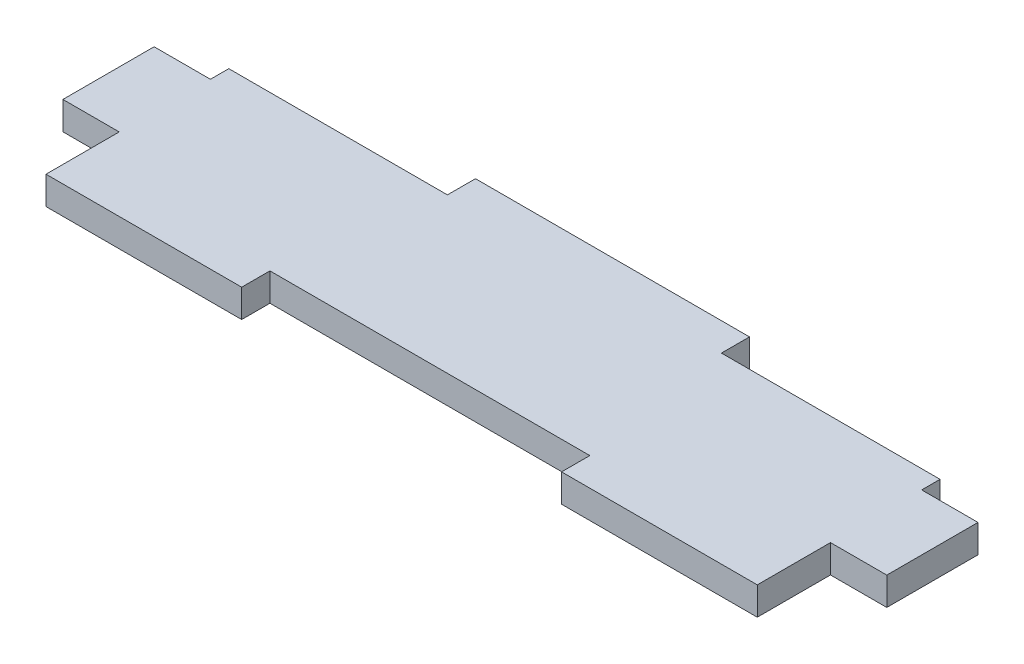
ISO-10303-21;
HEADER;
FILE_DESCRIPTION(('STEP AP214'),'2;1');
FILE_NAME('part.step','',(''),(''),'','','');
FILE_SCHEMA(('AUTOMOTIVE_DESIGN { 1 0 10303 214 1 1 1 1 }'));
ENDSEC;
DATA;
#1=APPLICATION_CONTEXT('core data for automotive mechanical design processes');
#2=APPLICATION_PROTOCOL_DEFINITION('international standard','automotive_design',2000,#1);
#3=PRODUCT_CONTEXT('',#1,'mechanical');
#4=PRODUCT('Part','Part','',(#3));
#5=PRODUCT_RELATED_PRODUCT_CATEGORY('part','',(#4));
#6=PRODUCT_DEFINITION_FORMATION('','',#4);
#7=PRODUCT_DEFINITION_CONTEXT('part definition',#1,'design');
#8=PRODUCT_DEFINITION('design','',#6,#7);
#9=PRODUCT_DEFINITION_SHAPE('','',#8);
#10=(LENGTH_UNIT() NAMED_UNIT(*) SI_UNIT(.MILLI.,.METRE.));
#11=(NAMED_UNIT(*) PLANE_ANGLE_UNIT() SI_UNIT($,.RADIAN.));
#12=(NAMED_UNIT(*) SI_UNIT($,.STERADIAN.) SOLID_ANGLE_UNIT());
#13=UNCERTAINTY_MEASURE_WITH_UNIT(LENGTH_MEASURE(1.E-05),#10,'distance_accuracy_value','');
#14=(GEOMETRIC_REPRESENTATION_CONTEXT(3) GLOBAL_UNCERTAINTY_ASSIGNED_CONTEXT((#13)) GLOBAL_UNIT_ASSIGNED_CONTEXT((#10,
#11,#12)) REPRESENTATION_CONTEXT('',''));
#15=CARTESIAN_POINT('',(0.,0.,0.));
#16=DIRECTION('',(0.,0.,1.));
#17=DIRECTION('',(1.,0.,0.));
#18=AXIS2_PLACEMENT_3D('',#15,#16,#17);
#19=CARTESIAN_POINT('',(14.99,-289.95,-3.08));
#20=DIRECTION('',(0.,0.,1.));
#21=DIRECTION('',(1.,0.,0.));
#22=AXIS2_PLACEMENT_3D('',#19,#20,#21);
#23=PLANE('',#22);
#24=DIRECTION('',(1.,0.,0.));
#25=VECTOR('',#24,1.);
#26=CARTESIAN_POINT('',(14.99,-286.88,-3.08));
#27=LINE('',#26,#25);
#28=CARTESIAN_POINT('',(-14.99,-286.88,-3.08));
#29=VERTEX_POINT('',#28);
#30=CARTESIAN_POINT('',(14.99,-286.88,-3.08));
#31=VERTEX_POINT('',#30);
#32=EDGE_CURVE('E211',#29,#31,#27,.T.);
#33=ORIENTED_EDGE('',*,*,#32,.T.);
#34=DIRECTION('',(0.,1.,0.));
#35=VECTOR('',#34,1.);
#36=CARTESIAN_POINT('',(14.99,-289.95,-3.08));
#37=LINE('',#36,#35);
#38=CARTESIAN_POINT('',(14.99,-289.95,-3.08));
#39=VERTEX_POINT('',#38);
#40=EDGE_CURVE('E11',#39,#31,#37,.T.);
#41=ORIENTED_EDGE('',*,*,#40,.F.);
#42=DIRECTION('',(1.,0.,0.));
#43=VECTOR('',#42,1.);
#44=CARTESIAN_POINT('',(14.99,-289.95,-3.08));
#45=LINE('',#44,#43);
#46=CARTESIAN_POINT('',(-14.99,-289.95,-3.08));
#47=VERTEX_POINT('',#46);
#48=EDGE_CURVE('E249',#47,#39,#45,.T.);
#49=ORIENTED_EDGE('',*,*,#48,.F.);
#50=DIRECTION('',(0.,1.,0.));
#51=VECTOR('',#50,1.);
#52=CARTESIAN_POINT('',(-14.99,-289.95,-3.08));
#53=LINE('',#52,#51);
#54=EDGE_CURVE('E207',#47,#29,#53,.T.);
#55=ORIENTED_EDGE('',*,*,#54,.T.);
#56=EDGE_LOOP('',(#33,#41,#49,#55));
#57=FACE_BOUND('',#56,.T.);
#58=ADVANCED_FACE('F43',(#57),#23,.F.);
#59=CARTESIAN_POINT('',(14.99,-289.95,-3.08));
#60=DIRECTION('',(-1.,0.,0.));
#61=DIRECTION('',(0.,0.,1.));
#62=AXIS2_PLACEMENT_3D('',#59,#60,#61);
#63=PLANE('',#62);
#64=DIRECTION('',(0.,0.,1.));
#65=VECTOR('',#64,1.);
#66=CARTESIAN_POINT('',(14.99,-286.88,-3.08));
#67=LINE('',#66,#65);
#68=CARTESIAN_POINT('',(14.99,-286.88,-0.0100000000000031));
#69=VERTEX_POINT('',#68);
#70=EDGE_CURVE('E214',#31,#69,#67,.T.);
#71=ORIENTED_EDGE('',*,*,#70,.T.);
#72=DIRECTION('',(0.,1.,0.));
#73=VECTOR('',#72,1.);
#74=CARTESIAN_POINT('',(14.99,-289.95,-0.0100000000000031));
#75=LINE('',#74,#73);
#76=CARTESIAN_POINT('',(14.99,-289.95,-0.0100000000000031));
#77=VERTEX_POINT('',#76);
#78=EDGE_CURVE('E51',#77,#69,#75,.T.);
#79=ORIENTED_EDGE('',*,*,#78,.F.);
#80=DIRECTION('',(0.,0.,1.));
#81=VECTOR('',#80,1.);
#82=CARTESIAN_POINT('',(14.99,-289.95,-3.08));
#83=LINE('',#82,#81);
#84=EDGE_CURVE('E138',#39,#77,#83,.T.);
#85=ORIENTED_EDGE('',*,*,#84,.F.);
#86=ORIENTED_EDGE('',*,*,#40,.T.);
#87=EDGE_LOOP('',(#71,#79,#85,#86));
#88=FACE_BOUND('',#87,.T.);
#89=ADVANCED_FACE('F368',(#88),#63,.F.);
#90=CARTESIAN_POINT('',(14.99,-289.95,-0.0100000000000031));
#91=DIRECTION('',(0.,0.,1.));
#92=DIRECTION('',(1.,0.,0.));
#93=AXIS2_PLACEMENT_3D('',#90,#91,#92);
#94=PLANE('',#93);
#95=DIRECTION('',(1.,0.,0.));
#96=VECTOR('',#95,1.);
#97=CARTESIAN_POINT('',(14.99,-286.88,-0.0100000000000031));
#98=LINE('',#97,#96);
#99=CARTESIAN_POINT('',(38.9099999999999,-286.88,-0.0100000000000069));
#100=VERTEX_POINT('',#99);
#101=EDGE_CURVE('E216',#69,#100,#98,.T.);
#102=ORIENTED_EDGE('',*,*,#101,.T.);
#103=DIRECTION('',(0.,1.,0.));
#104=VECTOR('',#103,1.);
#105=CARTESIAN_POINT('',(38.9099999999999,-289.95,-0.0100000000000069));
#106=LINE('',#105,#104);
#107=CARTESIAN_POINT('',(38.9099999999999,-289.95,-0.0100000000000069));
#108=VERTEX_POINT('',#107);
#109=EDGE_CURVE('E292',#108,#100,#106,.T.);
#110=ORIENTED_EDGE('',*,*,#109,.F.);
#111=DIRECTION('',(1.,0.,0.));
#112=VECTOR('',#111,1.);
#113=CARTESIAN_POINT('',(14.99,-289.95,-0.0100000000000031));
#114=LINE('',#113,#112);
#115=EDGE_CURVE('E300',#77,#108,#114,.T.);
#116=ORIENTED_EDGE('',*,*,#115,.F.);
#117=ORIENTED_EDGE('',*,*,#78,.T.);
#118=EDGE_LOOP('',(#102,#110,#116,#117));
#119=FACE_BOUND('',#118,.T.);
#120=ADVANCED_FACE('F298',(#119),#94,.F.);
#121=CARTESIAN_POINT('',(38.9099999999999,-289.95,-0.0100000000000069));
#122=DIRECTION('',(-1.,0.,0.));
#123=DIRECTION('',(0.,0.,1.));
#124=AXIS2_PLACEMENT_3D('',#121,#122,#123);
#125=PLANE('',#124);
#126=DIRECTION('',(0.,0.,1.));
#127=VECTOR('',#126,1.);
#128=CARTESIAN_POINT('',(38.9099999999999,-286.88,-0.0100000000000069));
#129=LINE('',#128,#127);
#130=CARTESIAN_POINT('',(38.9099999999999,-286.88,2.00000000000001));
#131=VERTEX_POINT('',#130);
#132=EDGE_CURVE('E218',#100,#131,#129,.T.);
#133=ORIENTED_EDGE('',*,*,#132,.T.);
#134=DIRECTION('',(0.,1.,0.));
#135=VECTOR('',#134,1.);
#136=CARTESIAN_POINT('',(38.9099999999999,-289.95,2.00000000000001));
#137=LINE('',#136,#135);
#138=CARTESIAN_POINT('',(38.9099999999999,-289.95,2.00000000000001));
#139=VERTEX_POINT('',#138);
#140=EDGE_CURVE('E289',#139,#131,#137,.T.);
#141=ORIENTED_EDGE('',*,*,#140,.F.);
#142=DIRECTION('',(0.,0.,1.));
#143=VECTOR('',#142,1.);
#144=CARTESIAN_POINT('',(38.9099999999999,-289.95,-0.0100000000000069));
#145=LINE('',#144,#143);
#146=EDGE_CURVE('E318',#108,#139,#145,.T.);
#147=ORIENTED_EDGE('',*,*,#146,.F.);
#148=ORIENTED_EDGE('',*,*,#109,.T.);
#149=EDGE_LOOP('',(#133,#141,#147,#148));
#150=FACE_BOUND('',#149,.T.);
#151=ADVANCED_FACE('F309',(#150),#125,.F.);
#152=CARTESIAN_POINT('',(38.9099999999999,-289.95,2.00000000000001));
#153=DIRECTION('',(0.,0.,1.));
#154=DIRECTION('',(1.,0.,0.));
#155=AXIS2_PLACEMENT_3D('',#152,#153,#154);
#156=PLANE('',#155);
#157=DIRECTION('',(1.,0.,0.));
#158=VECTOR('',#157,1.);
#159=CARTESIAN_POINT('',(38.9099999999999,-286.88,2.00000000000001));
#160=LINE('',#159,#158);
#161=CARTESIAN_POINT('',(45.07,-286.88,2.));
#162=VERTEX_POINT('',#161);
#163=EDGE_CURVE('E220',#131,#162,#160,.T.);
#164=ORIENTED_EDGE('',*,*,#163,.T.);
#165=DIRECTION('',(0.,1.,0.));
#166=VECTOR('',#165,1.);
#167=CARTESIAN_POINT('',(45.07,-289.95,2.));
#168=LINE('',#167,#166);
#169=CARTESIAN_POINT('',(45.07,-289.95,2.));
#170=VERTEX_POINT('',#169);
#171=EDGE_CURVE('E286',#170,#162,#168,.T.);
#172=ORIENTED_EDGE('',*,*,#171,.F.);
#173=DIRECTION('',(1.,0.,0.));
#174=VECTOR('',#173,1.);
#175=CARTESIAN_POINT('',(38.9099999999999,-289.95,2.00000000000001));
#176=LINE('',#175,#174);
#177=EDGE_CURVE('E315',#139,#170,#176,.T.);
#178=ORIENTED_EDGE('',*,*,#177,.F.);
#179=ORIENTED_EDGE('',*,*,#140,.T.);
#180=EDGE_LOOP('',(#164,#172,#178,#179));
#181=FACE_BOUND('',#180,.T.);
#182=ADVANCED_FACE('F313',(#181),#156,.F.);
#183=CARTESIAN_POINT('',(45.07,-289.95,2.));
#184=DIRECTION('',(-1.,0.,0.));
#185=DIRECTION('',(0.,0.,1.));
#186=AXIS2_PLACEMENT_3D('',#183,#184,#185);
#187=PLANE('',#186);
#188=DIRECTION('',(0.,0.,1.));
#189=VECTOR('',#188,1.);
#190=CARTESIAN_POINT('',(45.07,-286.88,2.));
#191=LINE('',#190,#189);
#192=CARTESIAN_POINT('',(45.07,-286.88,11.98));
#193=VERTEX_POINT('',#192);
#194=EDGE_CURVE('E222',#162,#193,#191,.T.);
#195=ORIENTED_EDGE('',*,*,#194,.T.);
#196=DIRECTION('',(0.,1.,0.));
#197=VECTOR('',#196,1.);
#198=CARTESIAN_POINT('',(45.07,-289.95,11.98));
#199=LINE('',#198,#197);
#200=CARTESIAN_POINT('',(45.07,-289.95,11.98));
#201=VERTEX_POINT('',#200);
#202=EDGE_CURVE('E283',#201,#193,#199,.T.);
#203=ORIENTED_EDGE('',*,*,#202,.F.);
#204=DIRECTION('',(0.,0.,1.));
#205=VECTOR('',#204,1.);
#206=CARTESIAN_POINT('',(45.07,-289.95,2.));
#207=LINE('',#206,#205);
#208=EDGE_CURVE('E317',#170,#201,#207,.T.);
#209=ORIENTED_EDGE('',*,*,#208,.F.);
#210=ORIENTED_EDGE('',*,*,#171,.T.);
#211=EDGE_LOOP('',(#195,#203,#209,#210));
#212=FACE_BOUND('',#211,.T.);
#213=ADVANCED_FACE('F383',(#212),#187,.F.);
#214=CARTESIAN_POINT('',(45.07,-289.95,11.98));
#215=DIRECTION('',(0.,0.,-1.));
#216=DIRECTION('',(-1.,0.,0.));
#217=AXIS2_PLACEMENT_3D('',#214,#215,#216);
#218=PLANE('',#217);
#219=DIRECTION('',(-1.,0.,0.));
#220=VECTOR('',#219,1.);
#221=CARTESIAN_POINT('',(45.07,-286.88,11.98));
#222=LINE('',#221,#220);
#223=CARTESIAN_POINT('',(38.9099999999999,-286.88,11.98));
#224=VERTEX_POINT('',#223);
#225=EDGE_CURVE('E224',#193,#224,#222,.T.);
#226=ORIENTED_EDGE('',*,*,#225,.T.);
#227=DIRECTION('',(0.,1.,0.));
#228=VECTOR('',#227,1.);
#229=CARTESIAN_POINT('',(38.9099999999999,-289.95,11.98));
#230=LINE('',#229,#228);
#231=CARTESIAN_POINT('',(38.9099999999999,-289.95,11.98));
#232=VERTEX_POINT('',#231);
#233=EDGE_CURVE('E280',#232,#224,#230,.T.);
#234=ORIENTED_EDGE('',*,*,#233,.F.);
#235=DIRECTION('',(-1.,0.,0.));
#236=VECTOR('',#235,1.);
#237=CARTESIAN_POINT('',(45.07,-289.95,11.98));
#238=LINE('',#237,#236);
#239=EDGE_CURVE('E320',#201,#232,#238,.T.);
#240=ORIENTED_EDGE('',*,*,#239,.F.);
#241=ORIENTED_EDGE('',*,*,#202,.T.);
#242=EDGE_LOOP('',(#226,#234,#240,#241));
#243=FACE_BOUND('',#242,.T.);
#244=ADVANCED_FACE('F386',(#243),#218,.F.);
#245=CARTESIAN_POINT('',(38.9099999999999,-289.95,11.98));
#246=DIRECTION('',(-1.,0.,0.));
#247=DIRECTION('',(0.,0.,1.));
#248=AXIS2_PLACEMENT_3D('',#245,#246,#247);
#249=PLANE('',#248);
#250=DIRECTION('',(0.,0.,1.));
#251=VECTOR('',#250,1.);
#252=CARTESIAN_POINT('',(38.9099999999999,-286.88,11.98));
#253=LINE('',#252,#251);
#254=CARTESIAN_POINT('',(38.9099999999999,-286.88,19.99));
#255=VERTEX_POINT('',#254);
#256=EDGE_CURVE('E226',#224,#255,#253,.T.);
#257=ORIENTED_EDGE('',*,*,#256,.T.);
#258=DIRECTION('',(0.,1.,0.));
#259=VECTOR('',#258,1.);
#260=CARTESIAN_POINT('',(38.9099999999999,-289.95,19.99));
#261=LINE('',#260,#259);
#262=CARTESIAN_POINT('',(38.9099999999999,-289.95,19.99));
#263=VERTEX_POINT('',#262);
#264=EDGE_CURVE('E277',#263,#255,#261,.T.);
#265=ORIENTED_EDGE('',*,*,#264,.F.);
#266=DIRECTION('',(0.,0.,1.));
#267=VECTOR('',#266,1.);
#268=CARTESIAN_POINT('',(38.9099999999999,-289.95,11.98));
#269=LINE('',#268,#267);
#270=EDGE_CURVE('E326',#232,#263,#269,.T.);
#271=ORIENTED_EDGE('',*,*,#270,.F.);
#272=ORIENTED_EDGE('',*,*,#233,.T.);
#273=EDGE_LOOP('',(#257,#265,#271,#272));
#274=FACE_BOUND('',#273,.T.);
#275=ADVANCED_FACE('F390',(#274),#249,.F.);
#276=CARTESIAN_POINT('',(17.5,-289.95,19.99));
#277=DIRECTION('',(0.,0.,-1.));
#278=DIRECTION('',(-1.,0.,0.));
#279=AXIS2_PLACEMENT_3D('',#276,#277,#278);
#280=PLANE('',#279);
#281=DIRECTION('',(-1.,0.,0.));
#282=VECTOR('',#281,1.);
#283=CARTESIAN_POINT('',(17.5,-286.88,19.99));
#284=LINE('',#283,#282);
#285=CARTESIAN_POINT('',(17.5,-286.88,19.99));
#286=VERTEX_POINT('',#285);
#287=EDGE_CURVE('E228',#255,#286,#284,.T.);
#288=ORIENTED_EDGE('',*,*,#287,.T.);
#289=DIRECTION('',(0.,1.,0.));
#290=VECTOR('',#289,1.);
#291=CARTESIAN_POINT('',(17.5,-289.95,19.99));
#292=LINE('',#291,#290);
#293=CARTESIAN_POINT('',(17.5,-289.95,19.99));
#294=VERTEX_POINT('',#293);
#295=EDGE_CURVE('E274',#294,#286,#292,.T.);
#296=ORIENTED_EDGE('',*,*,#295,.F.);
#297=DIRECTION('',(-1.,0.,0.));
#298=VECTOR('',#297,1.);
#299=CARTESIAN_POINT('',(17.5,-289.95,19.99));
#300=LINE('',#299,#298);
#301=EDGE_CURVE('E328',#263,#294,#300,.T.);
#302=ORIENTED_EDGE('',*,*,#301,.F.);
#303=ORIENTED_EDGE('',*,*,#264,.T.);
#304=EDGE_LOOP('',(#288,#296,#302,#303));
#305=FACE_BOUND('',#304,.T.);
#306=ADVANCED_FACE('F394',(#305),#280,.F.);
#307=CARTESIAN_POINT('',(17.5,-289.95,16.9));
#308=DIRECTION('',(1.,0.,0.));
#309=DIRECTION('',(0.,0.,-1.));
#310=AXIS2_PLACEMENT_3D('',#307,#308,#309);
#311=PLANE('',#310);
#312=DIRECTION('',(0.,0.,-1.));
#313=VECTOR('',#312,1.);
#314=CARTESIAN_POINT('',(17.5,-286.88,16.9));
#315=LINE('',#314,#313);
#316=CARTESIAN_POINT('',(17.5,-286.88,16.9));
#317=VERTEX_POINT('',#316);
#318=EDGE_CURVE('E230',#286,#317,#315,.T.);
#319=ORIENTED_EDGE('',*,*,#318,.T.);
#320=DIRECTION('',(0.,1.,0.));
#321=VECTOR('',#320,1.);
#322=CARTESIAN_POINT('',(17.5,-289.95,16.9));
#323=LINE('',#322,#321);
#324=CARTESIAN_POINT('',(17.5,-289.95,16.9));
#325=VERTEX_POINT('',#324);
#326=EDGE_CURVE('E271',#325,#317,#323,.T.);
#327=ORIENTED_EDGE('',*,*,#326,.F.);
#328=DIRECTION('',(0.,0.,-1.));
#329=VECTOR('',#328,1.);
#330=CARTESIAN_POINT('',(17.5,-289.95,16.9));
#331=LINE('',#330,#329);
#332=EDGE_CURVE('E330',#294,#325,#331,.T.);
#333=ORIENTED_EDGE('',*,*,#332,.F.);
#334=ORIENTED_EDGE('',*,*,#295,.T.);
#335=EDGE_LOOP('',(#319,#327,#333,#334));
#336=FACE_BOUND('',#335,.T.);
#337=ADVANCED_FACE('F398',(#336),#311,.F.);
#338=CARTESIAN_POINT('',(-17.5,-289.95,16.9));
#339=DIRECTION('',(0.,0.,-1.));
#340=DIRECTION('',(-1.,0.,0.));
#341=AXIS2_PLACEMENT_3D('',#338,#339,#340);
#342=PLANE('',#341);
#343=DIRECTION('',(-1.,0.,0.));
#344=VECTOR('',#343,1.);
#345=CARTESIAN_POINT('',(-17.5,-286.88,16.9));
#346=LINE('',#345,#344);
#347=CARTESIAN_POINT('',(-17.5,-286.88,16.9));
#348=VERTEX_POINT('',#347);
#349=EDGE_CURVE('E232',#317,#348,#346,.T.);
#350=ORIENTED_EDGE('',*,*,#349,.T.);
#351=DIRECTION('',(0.,1.,0.));
#352=VECTOR('',#351,1.);
#353=CARTESIAN_POINT('',(-17.5,-289.95,16.9));
#354=LINE('',#353,#352);
#355=CARTESIAN_POINT('',(-17.5,-289.95,16.9));
#356=VERTEX_POINT('',#355);
#357=EDGE_CURVE('E268',#356,#348,#354,.T.);
#358=ORIENTED_EDGE('',*,*,#357,.F.);
#359=DIRECTION('',(-1.,0.,0.));
#360=VECTOR('',#359,1.);
#361=CARTESIAN_POINT('',(-17.5,-289.95,16.9));
#362=LINE('',#361,#360);
#363=EDGE_CURVE('E332',#325,#356,#362,.T.);
#364=ORIENTED_EDGE('',*,*,#363,.F.);
#365=ORIENTED_EDGE('',*,*,#326,.T.);
#366=EDGE_LOOP('',(#350,#358,#364,#365));
#367=FACE_BOUND('',#366,.T.);
#368=ADVANCED_FACE('F402',(#367),#342,.F.);
#369=CARTESIAN_POINT('',(-17.5,-289.95,16.9));
#370=DIRECTION('',(-1.,0.,0.));
#371=DIRECTION('',(0.,0.,1.));
#372=AXIS2_PLACEMENT_3D('',#369,#370,#371);
#373=PLANE('',#372);
#374=DIRECTION('',(0.,0.,1.));
#375=VECTOR('',#374,1.);
#376=CARTESIAN_POINT('',(-17.5,-286.88,16.9));
#377=LINE('',#376,#375);
#378=CARTESIAN_POINT('',(-17.5,-286.88,19.99));
#379=VERTEX_POINT('',#378);
#380=EDGE_CURVE('E234',#348,#379,#377,.T.);
#381=ORIENTED_EDGE('',*,*,#380,.T.);
#382=DIRECTION('',(0.,1.,0.));
#383=VECTOR('',#382,1.);
#384=CARTESIAN_POINT('',(-17.5,-289.95,19.99));
#385=LINE('',#384,#383);
#386=CARTESIAN_POINT('',(-17.5,-289.95,19.99));
#387=VERTEX_POINT('',#386);
#388=EDGE_CURVE('E265',#387,#379,#385,.T.);
#389=ORIENTED_EDGE('',*,*,#388,.F.);
#390=DIRECTION('',(0.,0.,1.));
#391=VECTOR('',#390,1.);
#392=CARTESIAN_POINT('',(-17.5,-289.95,16.9));
#393=LINE('',#392,#391);
#394=EDGE_CURVE('E334',#356,#387,#393,.T.);
#395=ORIENTED_EDGE('',*,*,#394,.F.);
#396=ORIENTED_EDGE('',*,*,#357,.T.);
#397=EDGE_LOOP('',(#381,#389,#395,#396));
#398=FACE_BOUND('',#397,.T.);
#399=ADVANCED_FACE('F406',(#398),#373,.F.);
#400=CARTESIAN_POINT('',(-38.9099999999999,-289.95,19.99));
#401=DIRECTION('',(0.,0.,-1.));
#402=DIRECTION('',(-1.,0.,0.));
#403=AXIS2_PLACEMENT_3D('',#400,#401,#402);
#404=PLANE('',#403);
#405=DIRECTION('',(-1.,0.,0.));
#406=VECTOR('',#405,1.);
#407=CARTESIAN_POINT('',(-38.9099999999999,-286.88,19.99));
#408=LINE('',#407,#406);
#409=CARTESIAN_POINT('',(-38.9099999999999,-286.88,19.99));
#410=VERTEX_POINT('',#409);
#411=EDGE_CURVE('E236',#379,#410,#408,.T.);
#412=ORIENTED_EDGE('',*,*,#411,.T.);
#413=DIRECTION('',(0.,1.,0.));
#414=VECTOR('',#413,1.);
#415=CARTESIAN_POINT('',(-38.9099999999999,-289.95,19.99));
#416=LINE('',#415,#414);
#417=CARTESIAN_POINT('',(-38.9099999999999,-289.95,19.99));
#418=VERTEX_POINT('',#417);
#419=EDGE_CURVE('E262',#418,#410,#416,.T.);
#420=ORIENTED_EDGE('',*,*,#419,.F.);
#421=DIRECTION('',(-1.,0.,0.));
#422=VECTOR('',#421,1.);
#423=CARTESIAN_POINT('',(-38.9099999999999,-289.95,19.99));
#424=LINE('',#423,#422);
#425=EDGE_CURVE('E336',#387,#418,#424,.T.);
#426=ORIENTED_EDGE('',*,*,#425,.F.);
#427=ORIENTED_EDGE('',*,*,#388,.T.);
#428=EDGE_LOOP('',(#412,#420,#426,#427));
#429=FACE_BOUND('',#428,.T.);
#430=ADVANCED_FACE('F410',(#429),#404,.F.);
#431=CARTESIAN_POINT('',(-38.9099999999999,-289.95,11.98));
#432=DIRECTION('',(1.,0.,0.));
#433=DIRECTION('',(0.,0.,-1.));
#434=AXIS2_PLACEMENT_3D('',#431,#432,#433);
#435=PLANE('',#434);
#436=DIRECTION('',(0.,0.,-1.));
#437=VECTOR('',#436,1.);
#438=CARTESIAN_POINT('',(-38.9099999999999,-286.88,11.98));
#439=LINE('',#438,#437);
#440=CARTESIAN_POINT('',(-38.9099999999999,-286.88,11.98));
#441=VERTEX_POINT('',#440);
#442=EDGE_CURVE('E238',#410,#441,#439,.T.);
#443=ORIENTED_EDGE('',*,*,#442,.T.);
#444=DIRECTION('',(0.,1.,0.));
#445=VECTOR('',#444,1.);
#446=CARTESIAN_POINT('',(-38.9099999999999,-289.95,11.98));
#447=LINE('',#446,#445);
#448=CARTESIAN_POINT('',(-38.9099999999999,-289.95,11.98));
#449=VERTEX_POINT('',#448);
#450=EDGE_CURVE('E259',#449,#441,#447,.T.);
#451=ORIENTED_EDGE('',*,*,#450,.F.);
#452=DIRECTION('',(0.,0.,-1.));
#453=VECTOR('',#452,1.);
#454=CARTESIAN_POINT('',(-38.9099999999999,-289.95,11.98));
#455=LINE('',#454,#453);
#456=EDGE_CURVE('E338',#418,#449,#455,.T.);
#457=ORIENTED_EDGE('',*,*,#456,.F.);
#458=ORIENTED_EDGE('',*,*,#419,.T.);
#459=EDGE_LOOP('',(#443,#451,#457,#458));
#460=FACE_BOUND('',#459,.T.);
#461=ADVANCED_FACE('F414',(#460),#435,.F.);
#462=CARTESIAN_POINT('',(-45.07,-289.95,11.98));
#463=DIRECTION('',(0.,0.,-1.));
#464=DIRECTION('',(-1.,0.,0.));
#465=AXIS2_PLACEMENT_3D('',#462,#463,#464);
#466=PLANE('',#465);
#467=DIRECTION('',(-1.,0.,0.));
#468=VECTOR('',#467,1.);
#469=CARTESIAN_POINT('',(-45.07,-286.88,11.98));
#470=LINE('',#469,#468);
#471=CARTESIAN_POINT('',(-45.07,-286.88,11.98));
#472=VERTEX_POINT('',#471);
#473=EDGE_CURVE('E240',#441,#472,#470,.T.);
#474=ORIENTED_EDGE('',*,*,#473,.T.);
#475=DIRECTION('',(0.,1.,0.));
#476=VECTOR('',#475,1.);
#477=CARTESIAN_POINT('',(-45.07,-289.95,11.98));
#478=LINE('',#477,#476);
#479=CARTESIAN_POINT('',(-45.07,-289.95,11.98));
#480=VERTEX_POINT('',#479);
#481=EDGE_CURVE('E256',#480,#472,#478,.T.);
#482=ORIENTED_EDGE('',*,*,#481,.F.);
#483=DIRECTION('',(-1.,0.,0.));
#484=VECTOR('',#483,1.);
#485=CARTESIAN_POINT('',(-45.07,-289.95,11.98));
#486=LINE('',#485,#484);
#487=EDGE_CURVE('E340',#449,#480,#486,.T.);
#488=ORIENTED_EDGE('',*,*,#487,.F.);
#489=ORIENTED_EDGE('',*,*,#450,.T.);
#490=EDGE_LOOP('',(#474,#482,#488,#489));
#491=FACE_BOUND('',#490,.T.);
#492=ADVANCED_FACE('F418',(#491),#466,.F.);
#493=CARTESIAN_POINT('',(-45.07,-289.95,2.));
#494=DIRECTION('',(1.,0.,0.));
#495=DIRECTION('',(0.,0.,-1.));
#496=AXIS2_PLACEMENT_3D('',#493,#494,#495);
#497=PLANE('',#496);
#498=DIRECTION('',(0.,0.,-1.));
#499=VECTOR('',#498,1.);
#500=CARTESIAN_POINT('',(-45.07,-286.88,2.));
#501=LINE('',#500,#499);
#502=CARTESIAN_POINT('',(-45.07,-286.88,2.));
#503=VERTEX_POINT('',#502);
#504=EDGE_CURVE('E242',#472,#503,#501,.T.);
#505=ORIENTED_EDGE('',*,*,#504,.T.);
#506=DIRECTION('',(0.,1.,0.));
#507=VECTOR('',#506,1.);
#508=CARTESIAN_POINT('',(-45.07,-289.95,2.));
#509=LINE('',#508,#507);
#510=CARTESIAN_POINT('',(-45.07,-289.95,2.));
#511=VERTEX_POINT('',#510);
#512=EDGE_CURVE('E253',#511,#503,#509,.T.);
#513=ORIENTED_EDGE('',*,*,#512,.F.);
#514=DIRECTION('',(0.,0.,-1.));
#515=VECTOR('',#514,1.);
#516=CARTESIAN_POINT('',(-45.07,-289.95,2.));
#517=LINE('',#516,#515);
#518=EDGE_CURVE('E342',#480,#511,#517,.T.);
#519=ORIENTED_EDGE('',*,*,#518,.F.);
#520=ORIENTED_EDGE('',*,*,#481,.T.);
#521=EDGE_LOOP('',(#505,#513,#519,#520));
#522=FACE_BOUND('',#521,.T.);
#523=ADVANCED_FACE('F348',(#522),#497,.F.);
#524=CARTESIAN_POINT('',(-38.9099999999999,-289.95,2.00000000000001));
#525=DIRECTION('',(0.,0.,1.));
#526=DIRECTION('',(1.,0.,0.));
#527=AXIS2_PLACEMENT_3D('',#524,#525,#526);
#528=PLANE('',#527);
#529=DIRECTION('',(1.,0.,0.));
#530=VECTOR('',#529,1.);
#531=CARTESIAN_POINT('',(-38.9099999999999,-286.88,2.00000000000001));
#532=LINE('',#531,#530);
#533=CARTESIAN_POINT('',(-38.9099999999999,-286.88,2.00000000000001));
#534=VERTEX_POINT('',#533);
#535=EDGE_CURVE('E244',#503,#534,#532,.T.);
#536=ORIENTED_EDGE('',*,*,#535,.T.);
#537=DIRECTION('',(0.,1.,0.));
#538=VECTOR('',#537,1.);
#539=CARTESIAN_POINT('',(-38.9099999999999,-289.95,2.00000000000001));
#540=LINE('',#539,#538);
#541=CARTESIAN_POINT('',(-38.9099999999999,-289.95,2.00000000000001));
#542=VERTEX_POINT('',#541);
#543=EDGE_CURVE('E202',#542,#534,#540,.T.);
#544=ORIENTED_EDGE('',*,*,#543,.F.);
#545=DIRECTION('',(1.,0.,0.));
#546=VECTOR('',#545,1.);
#547=CARTESIAN_POINT('',(-38.9099999999999,-289.95,2.00000000000001));
#548=LINE('',#547,#546);
#549=EDGE_CURVE('E193',#511,#542,#548,.T.);
#550=ORIENTED_EDGE('',*,*,#549,.F.);
#551=ORIENTED_EDGE('',*,*,#512,.T.);
#552=EDGE_LOOP('',(#536,#544,#550,#551));
#553=FACE_BOUND('',#552,.T.);
#554=ADVANCED_FACE('F352',(#553),#528,.F.);
#555=CARTESIAN_POINT('',(-38.9099999999999,-289.95,-0.0100000000000069));
#556=DIRECTION('',(1.,0.,0.));
#557=DIRECTION('',(0.,0.,-1.));
#558=AXIS2_PLACEMENT_3D('',#555,#556,#557);
#559=PLANE('',#558);
#560=DIRECTION('',(0.,0.,-1.));
#561=VECTOR('',#560,1.);
#562=CARTESIAN_POINT('',(-38.9099999999999,-286.88,-0.0100000000000069));
#563=LINE('',#562,#561);
#564=CARTESIAN_POINT('',(-38.9099999999999,-286.88,-0.0100000000000069));
#565=VERTEX_POINT('',#564);
#566=EDGE_CURVE('E201',#534,#565,#563,.T.);
#567=ORIENTED_EDGE('',*,*,#566,.T.);
#568=DIRECTION('',(0.,1.,0.));
#569=VECTOR('',#568,1.);
#570=CARTESIAN_POINT('',(-38.9099999999999,-289.95,-0.0100000000000069));
#571=LINE('',#570,#569);
#572=CARTESIAN_POINT('',(-38.9099999999999,-289.95,-0.0100000000000069));
#573=VERTEX_POINT('',#572);
#574=EDGE_CURVE('E198',#573,#565,#571,.T.);
#575=ORIENTED_EDGE('',*,*,#574,.F.);
#576=DIRECTION('',(0.,0.,-1.));
#577=VECTOR('',#576,1.);
#578=CARTESIAN_POINT('',(-38.9099999999999,-289.95,-0.0100000000000069));
#579=LINE('',#578,#577);
#580=EDGE_CURVE('E187',#542,#573,#579,.T.);
#581=ORIENTED_EDGE('',*,*,#580,.F.);
#582=ORIENTED_EDGE('',*,*,#543,.T.);
#583=EDGE_LOOP('',(#567,#575,#581,#582));
#584=FACE_BOUND('',#583,.T.);
#585=ADVANCED_FACE('F199',(#584),#559,.F.);
#586=CARTESIAN_POINT('',(-14.99,-289.95,-0.0100000000000031));
#587=DIRECTION('',(0.,0.,1.));
#588=DIRECTION('',(1.,0.,0.));
#589=AXIS2_PLACEMENT_3D('',#586,#587,#588);
#590=PLANE('',#589);
#591=DIRECTION('',(1.,0.,0.));
#592=VECTOR('',#591,1.);
#593=CARTESIAN_POINT('',(-14.99,-286.88,-0.0100000000000031));
#594=LINE('',#593,#592);
#595=CARTESIAN_POINT('',(-14.99,-286.88,-0.0100000000000031));
#596=VERTEX_POINT('',#595);
#597=EDGE_CURVE('E124',#565,#596,#594,.T.);
#598=ORIENTED_EDGE('',*,*,#597,.T.);
#599=DIRECTION('',(0.,1.,0.));
#600=VECTOR('',#599,1.);
#601=CARTESIAN_POINT('',(-14.99,-289.95,-0.0100000000000031));
#602=LINE('',#601,#600);
#603=CARTESIAN_POINT('',(-14.99,-289.95,-0.0100000000000031));
#604=VERTEX_POINT('',#603);
#605=EDGE_CURVE('E203',#604,#596,#602,.T.);
#606=ORIENTED_EDGE('',*,*,#605,.F.);
#607=DIRECTION('',(1.,0.,0.));
#608=VECTOR('',#607,1.);
#609=CARTESIAN_POINT('',(-14.99,-289.95,-0.0100000000000031));
#610=LINE('',#609,#608);
#611=EDGE_CURVE('E191',#573,#604,#610,.T.);
#612=ORIENTED_EDGE('',*,*,#611,.F.);
#613=ORIENTED_EDGE('',*,*,#574,.T.);
#614=EDGE_LOOP('',(#598,#606,#612,#613));
#615=FACE_BOUND('',#614,.T.);
#616=ADVANCED_FACE('F205',(#615),#590,.F.);
#617=CARTESIAN_POINT('',(-14.99,-289.95,-3.08));
#618=DIRECTION('',(1.,0.,0.));
#619=DIRECTION('',(0.,0.,-1.));
#620=AXIS2_PLACEMENT_3D('',#617,#618,#619);
#621=PLANE('',#620);
#622=DIRECTION('',(0.,0.,-1.));
#623=VECTOR('',#622,1.);
#624=CARTESIAN_POINT('',(-14.99,-286.88,-3.08));
#625=LINE('',#624,#623);
#626=EDGE_CURVE('E130',#596,#29,#625,.T.);
#627=ORIENTED_EDGE('',*,*,#626,.T.);
#628=ORIENTED_EDGE('',*,*,#54,.F.);
#629=DIRECTION('',(0.,0.,-1.));
#630=VECTOR('',#629,1.);
#631=CARTESIAN_POINT('',(-14.99,-289.95,-3.08));
#632=LINE('',#631,#630);
#633=EDGE_CURVE('E59',#604,#47,#632,.T.);
#634=ORIENTED_EDGE('',*,*,#633,.F.);
#635=ORIENTED_EDGE('',*,*,#605,.T.);
#636=EDGE_LOOP('',(#627,#628,#634,#635));
#637=FACE_BOUND('',#636,.T.);
#638=ADVANCED_FACE('F356',(#637),#621,.F.);
#639=CARTESIAN_POINT('',(0.,-289.95,0.));
#640=DIRECTION('',(0.,1.,0.));
#641=DIRECTION('',(0.,0.,1.));
#642=AXIS2_PLACEMENT_3D('',#639,#640,#641);
#643=PLANE('',#642);
#644=ORIENTED_EDGE('',*,*,#48,.T.);
#645=ORIENTED_EDGE('',*,*,#84,.T.);
#646=ORIENTED_EDGE('',*,*,#115,.T.);
#647=ORIENTED_EDGE('',*,*,#146,.T.);
#648=ORIENTED_EDGE('',*,*,#177,.T.);
#649=ORIENTED_EDGE('',*,*,#208,.T.);
#650=ORIENTED_EDGE('',*,*,#239,.T.);
#651=ORIENTED_EDGE('',*,*,#270,.T.);
#652=ORIENTED_EDGE('',*,*,#301,.T.);
#653=ORIENTED_EDGE('',*,*,#332,.T.);
#654=ORIENTED_EDGE('',*,*,#363,.T.);
#655=ORIENTED_EDGE('',*,*,#394,.T.);
#656=ORIENTED_EDGE('',*,*,#425,.T.);
#657=ORIENTED_EDGE('',*,*,#456,.T.);
#658=ORIENTED_EDGE('',*,*,#487,.T.);
#659=ORIENTED_EDGE('',*,*,#518,.T.);
#660=ORIENTED_EDGE('',*,*,#549,.T.);
#661=ORIENTED_EDGE('',*,*,#580,.T.);
#662=ORIENTED_EDGE('',*,*,#611,.T.);
#663=ORIENTED_EDGE('',*,*,#633,.T.);
#664=EDGE_LOOP('',(#644,#645,#646,#647,#648,#649,#650,#651,#652,#653,#654,#655,#656,#657,#658,
#659,#660,#661,#662,#663));
#665=FACE_BOUND('',#664,.T.);
#666=ADVANCED_FACE('F189',(#665),#643,.F.);
#667=CARTESIAN_POINT('',(0.,-286.88,0.));
#668=DIRECTION('',(0.,1.,0.));
#669=DIRECTION('',(0.,0.,1.));
#670=AXIS2_PLACEMENT_3D('',#667,#668,#669);
#671=PLANE('',#670);
#672=ORIENTED_EDGE('',*,*,#32,.F.);
#673=ORIENTED_EDGE('',*,*,#626,.F.);
#674=ORIENTED_EDGE('',*,*,#597,.F.);
#675=ORIENTED_EDGE('',*,*,#566,.F.);
#676=ORIENTED_EDGE('',*,*,#535,.F.);
#677=ORIENTED_EDGE('',*,*,#504,.F.);
#678=ORIENTED_EDGE('',*,*,#473,.F.);
#679=ORIENTED_EDGE('',*,*,#442,.F.);
#680=ORIENTED_EDGE('',*,*,#411,.F.);
#681=ORIENTED_EDGE('',*,*,#380,.F.);
#682=ORIENTED_EDGE('',*,*,#349,.F.);
#683=ORIENTED_EDGE('',*,*,#318,.F.);
#684=ORIENTED_EDGE('',*,*,#287,.F.);
#685=ORIENTED_EDGE('',*,*,#256,.F.);
#686=ORIENTED_EDGE('',*,*,#225,.F.);
#687=ORIENTED_EDGE('',*,*,#194,.F.);
#688=ORIENTED_EDGE('',*,*,#163,.F.);
#689=ORIENTED_EDGE('',*,*,#132,.F.);
#690=ORIENTED_EDGE('',*,*,#101,.F.);
#691=ORIENTED_EDGE('',*,*,#70,.F.);
#692=EDGE_LOOP('',(#672,#673,#674,#675,#676,#677,#678,#679,#680,#681,#682,#683,#684,#685,#686,
#687,#688,#689,#690,#691));
#693=FACE_BOUND('',#692,.T.);
#694=ADVANCED_FACE('F304',(#693),#671,.T.);
#695=CLOSED_SHELL('',(#58,#89,#120,#151,#182,#213,#244,#275,#306,#337,#368,#399,#430,#461,#492,
#523,#554,#585,#616,#638,#666,#694));
#696=MANIFOLD_SOLID_BREP('B2',#695);
#697=ADVANCED_BREP_SHAPE_REPRESENTATION('',(#18,#696),#14);
#698=SHAPE_DEFINITION_REPRESENTATION(#9,#697);
ENDSEC;
END-ISO-10303-21;
